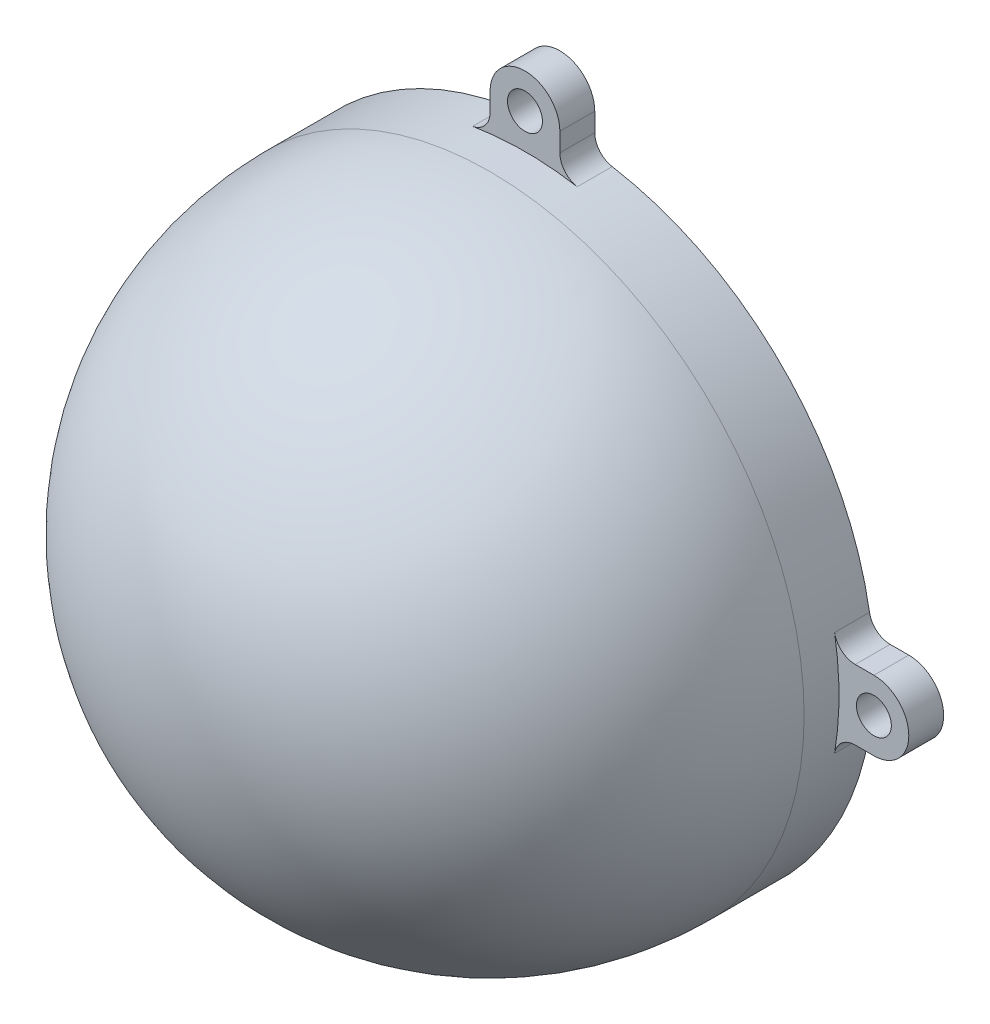
ISO-10303-21;
HEADER;
FILE_DESCRIPTION(('STEP AP214'),'2;1');
FILE_NAME('part.step','',(''),(''),'','','');
FILE_SCHEMA(('AUTOMOTIVE_DESIGN { 1 0 10303 214 1 1 1 1 }'));
ENDSEC;
DATA;
#1=APPLICATION_CONTEXT('core data for automotive mechanical design processes');
#2=APPLICATION_PROTOCOL_DEFINITION('international standard','automotive_design',2000,#1);
#3=PRODUCT_CONTEXT('',#1,'mechanical');
#4=PRODUCT('Part','Part','',(#3));
#5=PRODUCT_RELATED_PRODUCT_CATEGORY('part','',(#4));
#6=PRODUCT_DEFINITION_FORMATION('','',#4);
#7=PRODUCT_DEFINITION_CONTEXT('part definition',#1,'design');
#8=PRODUCT_DEFINITION('design','',#6,#7);
#9=PRODUCT_DEFINITION_SHAPE('','',#8);
#10=(LENGTH_UNIT() NAMED_UNIT(*) SI_UNIT(.MILLI.,.METRE.));
#11=(NAMED_UNIT(*) PLANE_ANGLE_UNIT() SI_UNIT($,.RADIAN.));
#12=(NAMED_UNIT(*) SI_UNIT($,.STERADIAN.) SOLID_ANGLE_UNIT());
#13=UNCERTAINTY_MEASURE_WITH_UNIT(LENGTH_MEASURE(1.E-05),#10,'distance_accuracy_value','');
#14=(GEOMETRIC_REPRESENTATION_CONTEXT(3) GLOBAL_UNCERTAINTY_ASSIGNED_CONTEXT((#13)) GLOBAL_UNIT_ASSIGNED_CONTEXT((#10,
#11,#12)) REPRESENTATION_CONTEXT('',''));
#15=CARTESIAN_POINT('',(0.,0.,0.));
#16=DIRECTION('',(0.,0.,1.));
#17=DIRECTION('',(1.,0.,0.));
#18=AXIS2_PLACEMENT_3D('',#15,#16,#17);
#19=CARTESIAN_POINT('',(0.,0.,10.));
#20=DIRECTION('',(0.,0.,-1.));
#21=DIRECTION('',(-1.,0.,0.));
#22=AXIS2_PLACEMENT_3D('',#19,#20,#21);
#23=CYLINDRICAL_SURFACE('',#22,45.);
#24=CARTESIAN_POINT('',(0.,0.,10.));
#25=DIRECTION('',(0.,0.,1.));
#26=DIRECTION('',(1.,0.,0.));
#27=AXIS2_PLACEMENT_3D('',#24,#25,#26);
#28=CIRCLE('',#27,45.);
#29=CARTESIAN_POINT('',(45.,0.,10.));
#30=VERTEX_POINT('',#29);
#31=EDGE_CURVE('E328',#30,#30,#28,.T.);
#32=ORIENTED_EDGE('',*,*,#31,.F.);
#33=EDGE_LOOP('',(#32));
#34=FACE_BOUND('',#33,.T.);
#35=CARTESIAN_POINT('',(0.,0.,0.));
#36=DIRECTION('',(0.,0.,1.));
#37=DIRECTION('',(1.,0.,0.));
#38=AXIS2_PLACEMENT_3D('',#35,#36,#37);
#39=CIRCLE('',#38,45.);
#40=CARTESIAN_POINT('',(7.5,-44.3705983732471,0.));
#41=VERTEX_POINT('',#40);
#42=CARTESIAN_POINT('',(44.3705983732472,-7.49999999999953,0.));
#43=VERTEX_POINT('',#42);
#44=EDGE_CURVE('E412',#41,#43,#39,.T.);
#45=ORIENTED_EDGE('',*,*,#44,.T.);
#46=DIRECTION('',(0.,0.,-1.));
#47=VECTOR('',#46,1.);
#48=CARTESIAN_POINT('',(44.3705983732472,-7.49999999999953,10.));
#49=LINE('',#48,#47);
#50=CARTESIAN_POINT('',(44.3705983732472,-7.49999999999953,5.));
#51=VERTEX_POINT('',#50);
#52=EDGE_CURVE('E401',#43,#51,#49,.F.);
#53=ORIENTED_EDGE('',*,*,#52,.T.);
#54=CARTESIAN_POINT('',(0.,0.,5.));
#55=DIRECTION('',(0.,0.,-1.));
#56=DIRECTION('',(0.,-1.,0.));
#57=AXIS2_PLACEMENT_3D('',#54,#55,#56);
#58=CIRCLE('',#57,45.);
#59=CARTESIAN_POINT('',(44.370598373247,7.50000000000046,5.));
#60=VERTEX_POINT('',#59);
#61=EDGE_CURVE('E212',#60,#51,#58,.T.);
#62=ORIENTED_EDGE('',*,*,#61,.F.);
#63=DIRECTION('',(0.,0.,-1.));
#64=VECTOR('',#63,1.);
#65=CARTESIAN_POINT('',(44.370598373247,7.50000000000046,10.));
#66=LINE('',#65,#64);
#67=CARTESIAN_POINT('',(44.370598373247,7.50000000000046,0.));
#68=VERTEX_POINT('',#67);
#69=EDGE_CURVE('E398',#60,#68,#66,.T.);
#70=ORIENTED_EDGE('',*,*,#69,.T.);
#71=CARTESIAN_POINT('',(7.5,44.3705983732471,0.));
#72=VERTEX_POINT('',#71);
#73=EDGE_CURVE('E327',#68,#72,#39,.T.);
#74=ORIENTED_EDGE('',*,*,#73,.T.);
#75=DIRECTION('',(0.,0.,-1.));
#76=VECTOR('',#75,1.);
#77=CARTESIAN_POINT('',(7.5,44.3705983732471,10.));
#78=LINE('',#77,#76);
#79=CARTESIAN_POINT('',(7.5,44.3705983732471,5.));
#80=VERTEX_POINT('',#79);
#81=EDGE_CURVE('E341',#72,#80,#78,.F.);
#82=ORIENTED_EDGE('',*,*,#81,.T.);
#83=CARTESIAN_POINT('',(0.,0.,5.));
#84=DIRECTION('',(0.,0.,-1.));
#85=DIRECTION('',(1.,0.,0.));
#86=AXIS2_PLACEMENT_3D('',#83,#84,#85);
#87=CIRCLE('',#86,45.);
#88=CARTESIAN_POINT('',(-7.5,44.3705983732471,5.));
#89=VERTEX_POINT('',#88);
#90=EDGE_CURVE('E300',#89,#80,#87,.T.);
#91=ORIENTED_EDGE('',*,*,#90,.F.);
#92=DIRECTION('',(0.,0.,-1.));
#93=VECTOR('',#92,1.);
#94=CARTESIAN_POINT('',(-7.5,44.3705983732471,10.));
#95=LINE('',#94,#93);
#96=CARTESIAN_POINT('',(-7.5,44.3705983732471,0.));
#97=VERTEX_POINT('',#96);
#98=EDGE_CURVE('E338',#89,#97,#95,.T.);
#99=ORIENTED_EDGE('',*,*,#98,.T.);
#100=CARTESIAN_POINT('',(-44.3705983732472,7.49999999999984,0.));
#101=VERTEX_POINT('',#100);
#102=EDGE_CURVE('E332',#97,#101,#39,.T.);
#103=ORIENTED_EDGE('',*,*,#102,.T.);
#104=DIRECTION('',(0.,0.,-1.));
#105=VECTOR('',#104,1.);
#106=CARTESIAN_POINT('',(-44.3705983732472,7.49999999999985,10.));
#107=LINE('',#106,#105);
#108=CARTESIAN_POINT('',(-44.3705983732472,7.49999999999984,5.));
#109=VERTEX_POINT('',#108);
#110=EDGE_CURVE('E362',#101,#109,#107,.F.);
#111=ORIENTED_EDGE('',*,*,#110,.T.);
#112=CARTESIAN_POINT('',(0.,0.,5.));
#113=DIRECTION('',(0.,0.,-1.));
#114=DIRECTION('',(0.,1.,0.));
#115=AXIS2_PLACEMENT_3D('',#112,#113,#114);
#116=CIRCLE('',#115,45.);
#117=CARTESIAN_POINT('',(-44.3705983732471,-7.50000000000015,5.));
#118=VERTEX_POINT('',#117);
#119=EDGE_CURVE('E272',#118,#109,#116,.T.);
#120=ORIENTED_EDGE('',*,*,#119,.F.);
#121=DIRECTION('',(0.,0.,-1.));
#122=VECTOR('',#121,1.);
#123=CARTESIAN_POINT('',(-44.3705983732471,-7.50000000000015,10.));
#124=LINE('',#123,#122);
#125=CARTESIAN_POINT('',(-44.3705983732471,-7.50000000000015,0.));
#126=VERTEX_POINT('',#125);
#127=EDGE_CURVE('E359',#118,#126,#124,.T.);
#128=ORIENTED_EDGE('',*,*,#127,.T.);
#129=CARTESIAN_POINT('',(-7.5,-44.3705983732471,0.));
#130=VERTEX_POINT('',#129);
#131=EDGE_CURVE('E335',#126,#130,#39,.T.);
#132=ORIENTED_EDGE('',*,*,#131,.T.);
#133=DIRECTION('',(0.,0.,-1.));
#134=VECTOR('',#133,1.);
#135=CARTESIAN_POINT('',(-7.5,-44.3705983732471,10.));
#136=LINE('',#135,#134);
#137=CARTESIAN_POINT('',(-7.5,-44.3705983732471,5.));
#138=VERTEX_POINT('',#137);
#139=EDGE_CURVE('E382',#130,#138,#136,.F.);
#140=ORIENTED_EDGE('',*,*,#139,.T.);
#141=CARTESIAN_POINT('',(0.,0.,5.));
#142=DIRECTION('',(0.,0.,-1.));
#143=DIRECTION('',(-1.,0.,0.));
#144=AXIS2_PLACEMENT_3D('',#141,#142,#143);
#145=CIRCLE('',#144,45.);
#146=CARTESIAN_POINT('',(7.5,-44.3705983732471,5.));
#147=VERTEX_POINT('',#146);
#148=EDGE_CURVE('E244',#147,#138,#145,.T.);
#149=ORIENTED_EDGE('',*,*,#148,.F.);
#150=DIRECTION('',(0.,0.,-1.));
#151=VECTOR('',#150,1.);
#152=CARTESIAN_POINT('',(7.5,-44.3705983732471,10.));
#153=LINE('',#152,#151);
#154=EDGE_CURVE('E379',#147,#41,#153,.T.);
#155=ORIENTED_EDGE('',*,*,#154,.T.);
#156=EDGE_LOOP('',(#45,#53,#62,#70,#74,#82,#91,#99,#103,#111,#120,#128,#132,#140,#149,#155));
#157=FACE_BOUND('',#156,.T.);
#158=ADVANCED_FACE('F39',(#34,#157),#23,.T.);
#159=CARTESIAN_POINT('',(0.,0.,0.));
#160=DIRECTION('',(0.,0.,1.));
#161=DIRECTION('',(1.,0.,0.));
#162=AXIS2_PLACEMENT_3D('',#159,#160,#161);
#163=PLANE('',#162);
#164=ORIENTED_EDGE('',*,*,#102,.F.);
#165=CARTESIAN_POINT('',(-8.,47.3286382647969,0.));
#166=DIRECTION('',(0.,0.,1.));
#167=DIRECTION('',(1.,0.,0.));
#168=AXIS2_PLACEMENT_3D('',#165,#166,#167);
#169=CIRCLE('',#168,3.);
#170=CARTESIAN_POINT('',(-5.,47.3286382647969,0.));
#171=VERTEX_POINT('',#170);
#172=EDGE_CURVE('E351',#97,#171,#169,.T.);
#173=ORIENTED_EDGE('',*,*,#172,.T.);
#174=DIRECTION('',(0.,-1.,0.));
#175=VECTOR('',#174,1.);
#176=CARTESIAN_POINT('',(-5.,50.,0.));
#177=LINE('',#176,#175);
#178=CARTESIAN_POINT('',(-5.,50.,0.));
#179=VERTEX_POINT('',#178);
#180=EDGE_CURVE('E303',#179,#171,#177,.T.);
#181=ORIENTED_EDGE('',*,*,#180,.F.);
#182=CARTESIAN_POINT('',(0.,50.,0.));
#183=DIRECTION('',(0.,0.,1.));
#184=DIRECTION('',(1.,0.,0.));
#185=AXIS2_PLACEMENT_3D('',#182,#183,#184);
#186=CIRCLE('',#185,5.);
#187=CARTESIAN_POINT('',(5.,50.,0.));
#188=VERTEX_POINT('',#187);
#189=EDGE_CURVE('E312',#188,#179,#186,.T.);
#190=ORIENTED_EDGE('',*,*,#189,.F.);
#191=DIRECTION('',(0.,1.,0.));
#192=VECTOR('',#191,1.);
#193=CARTESIAN_POINT('',(5.,44.7213595499958,0.));
#194=LINE('',#193,#192);
#195=CARTESIAN_POINT('',(5.,47.3286382647969,0.));
#196=VERTEX_POINT('',#195);
#197=EDGE_CURVE('E297',#196,#188,#194,.T.);
#198=ORIENTED_EDGE('',*,*,#197,.F.);
#199=CARTESIAN_POINT('',(8.,47.3286382647969,0.));
#200=DIRECTION('',(0.,0.,1.));
#201=DIRECTION('',(1.,0.,0.));
#202=AXIS2_PLACEMENT_3D('',#199,#200,#201);
#203=CIRCLE('',#202,3.);
#204=EDGE_CURVE('E346',#196,#72,#203,.T.);
#205=ORIENTED_EDGE('',*,*,#204,.T.);
#206=ORIENTED_EDGE('',*,*,#73,.F.);
#207=CARTESIAN_POINT('',(47.3286382647969,8.00000000000049,0.));
#208=DIRECTION('',(0.,0.,1.));
#209=DIRECTION('',(1.,0.,0.));
#210=AXIS2_PLACEMENT_3D('',#207,#208,#209);
#211=CIRCLE('',#210,3.);
#212=CARTESIAN_POINT('',(47.3286382647969,5.0000000000005,0.));
#213=VERTEX_POINT('',#212);
#214=EDGE_CURVE('E47',#68,#213,#211,.T.);
#215=ORIENTED_EDGE('',*,*,#214,.T.);
#216=DIRECTION('',(-1.,0.,0.));
#217=VECTOR('',#216,1.);
#218=CARTESIAN_POINT('',(50.,5.00000000000052,0.));
#219=LINE('',#218,#217);
#220=CARTESIAN_POINT('',(50.,5.00000000000052,0.));
#221=VERTEX_POINT('',#220);
#222=EDGE_CURVE('E235',#221,#213,#219,.T.);
#223=ORIENTED_EDGE('',*,*,#222,.F.);
#224=CARTESIAN_POINT('',(50.,5.2372220082647E-13,0.));
#225=DIRECTION('',(0.,0.,1.));
#226=DIRECTION('',(0.,-1.,0.));
#227=AXIS2_PLACEMENT_3D('',#224,#225,#226);
#228=CIRCLE('',#227,5.);
#229=CARTESIAN_POINT('',(50.0000000000001,-4.99999999999948,0.));
#230=VERTEX_POINT('',#229);
#231=EDGE_CURVE('E232',#230,#221,#228,.T.);
#232=ORIENTED_EDGE('',*,*,#231,.F.);
#233=DIRECTION('',(1.,0.,0.));
#234=VECTOR('',#233,1.);
#235=CARTESIAN_POINT('',(44.7213595499959,-4.99999999999953,0.));
#236=LINE('',#235,#234);
#237=CARTESIAN_POINT('',(47.328638264797,-4.9999999999995,0.));
#238=VERTEX_POINT('',#237);
#239=EDGE_CURVE('E218',#238,#230,#236,.T.);
#240=ORIENTED_EDGE('',*,*,#239,.F.);
#241=CARTESIAN_POINT('',(47.328638264797,-7.9999999999995,0.));
#242=DIRECTION('',(0.,0.,1.));
#243=DIRECTION('',(1.,0.,0.));
#244=AXIS2_PLACEMENT_3D('',#241,#242,#243);
#245=CIRCLE('',#244,3.);
#246=EDGE_CURVE('E405',#238,#43,#245,.T.);
#247=ORIENTED_EDGE('',*,*,#246,.T.);
#248=ORIENTED_EDGE('',*,*,#44,.F.);
#249=CARTESIAN_POINT('',(8.,-47.3286382647969,0.));
#250=DIRECTION('',(0.,0.,1.));
#251=DIRECTION('',(1.,0.,0.));
#252=AXIS2_PLACEMENT_3D('',#249,#250,#251);
#253=CIRCLE('',#252,3.);
#254=CARTESIAN_POINT('',(5.,-47.3286382647969,0.));
#255=VERTEX_POINT('',#254);
#256=EDGE_CURVE('E391',#41,#255,#253,.T.);
#257=ORIENTED_EDGE('',*,*,#256,.T.);
#258=DIRECTION('',(0.,1.,0.));
#259=VECTOR('',#258,1.);
#260=CARTESIAN_POINT('',(5.,-50.,0.));
#261=LINE('',#260,#259);
#262=CARTESIAN_POINT('',(5.,-50.,0.));
#263=VERTEX_POINT('',#262);
#264=EDGE_CURVE('E247',#263,#255,#261,.T.);
#265=ORIENTED_EDGE('',*,*,#264,.F.);
#266=CARTESIAN_POINT('',(0.,-50.,0.));
#267=DIRECTION('',(0.,0.,1.));
#268=DIRECTION('',(-1.,0.,0.));
#269=AXIS2_PLACEMENT_3D('',#266,#267,#268);
#270=CIRCLE('',#269,5.);
#271=CARTESIAN_POINT('',(-5.,-50.,0.));
#272=VERTEX_POINT('',#271);
#273=EDGE_CURVE('E256',#272,#263,#270,.T.);
#274=ORIENTED_EDGE('',*,*,#273,.F.);
#275=DIRECTION('',(0.,-1.,0.));
#276=VECTOR('',#275,1.);
#277=CARTESIAN_POINT('',(-5.,-44.7213595499958,0.));
#278=LINE('',#277,#276);
#279=CARTESIAN_POINT('',(-5.,-47.3286382647969,0.));
#280=VERTEX_POINT('',#279);
#281=EDGE_CURVE('E241',#280,#272,#278,.T.);
#282=ORIENTED_EDGE('',*,*,#281,.F.);
#283=CARTESIAN_POINT('',(-8.,-47.3286382647969,0.));
#284=DIRECTION('',(0.,0.,1.));
#285=DIRECTION('',(1.,0.,0.));
#286=AXIS2_PLACEMENT_3D('',#283,#284,#285);
#287=CIRCLE('',#286,3.);
#288=EDGE_CURVE('E387',#280,#130,#287,.T.);
#289=ORIENTED_EDGE('',*,*,#288,.T.);
#290=ORIENTED_EDGE('',*,*,#131,.F.);
#291=CARTESIAN_POINT('',(-47.3286382647969,-8.00000000000017,0.));
#292=DIRECTION('',(0.,0.,1.));
#293=DIRECTION('',(1.,0.,0.));
#294=AXIS2_PLACEMENT_3D('',#291,#292,#293);
#295=CIRCLE('',#294,3.);
#296=CARTESIAN_POINT('',(-47.3286382647969,-5.00000000000017,0.));
#297=VERTEX_POINT('',#296);
#298=EDGE_CURVE('E371',#126,#297,#295,.T.);
#299=ORIENTED_EDGE('',*,*,#298,.T.);
#300=DIRECTION('',(1.,0.,0.));
#301=VECTOR('',#300,1.);
#302=CARTESIAN_POINT('',(-50.,-5.00000000000017,0.));
#303=LINE('',#302,#301);
#304=CARTESIAN_POINT('',(-50.,-5.00000000000017,0.));
#305=VERTEX_POINT('',#304);
#306=EDGE_CURVE('E275',#305,#297,#303,.T.);
#307=ORIENTED_EDGE('',*,*,#306,.F.);
#308=CARTESIAN_POINT('',(-50.,-1.74574066942157E-13,0.));
#309=DIRECTION('',(0.,0.,1.));
#310=DIRECTION('',(0.,1.,0.));
#311=AXIS2_PLACEMENT_3D('',#308,#309,#310);
#312=CIRCLE('',#311,5.);
#313=CARTESIAN_POINT('',(-50.,4.99999999999983,0.));
#314=VERTEX_POINT('',#313);
#315=EDGE_CURVE('E284',#314,#305,#312,.T.);
#316=ORIENTED_EDGE('',*,*,#315,.F.);
#317=DIRECTION('',(-1.,0.,0.));
#318=VECTOR('',#317,1.);
#319=CARTESIAN_POINT('',(-44.7213595499958,4.99999999999984,0.));
#320=LINE('',#319,#318);
#321=CARTESIAN_POINT('',(-47.328638264797,4.99999999999984,0.));
#322=VERTEX_POINT('',#321);
#323=EDGE_CURVE('E269',#322,#314,#320,.T.);
#324=ORIENTED_EDGE('',*,*,#323,.F.);
#325=CARTESIAN_POINT('',(-47.328638264797,7.99999999999984,0.));
#326=DIRECTION('',(0.,0.,1.));
#327=DIRECTION('',(1.,0.,0.));
#328=AXIS2_PLACEMENT_3D('',#325,#326,#327);
#329=CIRCLE('',#328,3.);
#330=EDGE_CURVE('E367',#322,#101,#329,.T.);
#331=ORIENTED_EDGE('',*,*,#330,.T.);
#332=EDGE_LOOP('',(#164,#173,#181,#190,#198,#205,#206,#215,#223,#232,#240,#247,#248,#257,#265,
#274,#282,#289,#290,#299,#307,#316,#324,#331));
#333=FACE_BOUND('',#332,.T.);
#334=CARTESIAN_POINT('',(0.,0.,0.));
#335=DIRECTION('',(0.,0.,1.));
#336=DIRECTION('',(1.,0.,0.));
#337=AXIS2_PLACEMENT_3D('',#334,#335,#336);
#338=CIRCLE('',#337,42.5);
#339=CARTESIAN_POINT('',(42.5,0.,0.));
#340=VERTEX_POINT('',#339);
#341=EDGE_CURVE('E324',#340,#340,#338,.T.);
#342=ORIENTED_EDGE('',*,*,#341,.T.);
#343=EDGE_LOOP('',(#342));
#344=FACE_BOUND('',#343,.T.);
#345=CARTESIAN_POINT('',(0.,50.,0.));
#346=DIRECTION('',(0.,0.,1.));
#347=DIRECTION('',(1.,0.,0.));
#348=AXIS2_PLACEMENT_3D('',#345,#346,#347);
#349=CIRCLE('',#348,2.5);
#350=CARTESIAN_POINT('',(2.5,50.,0.));
#351=VERTEX_POINT('',#350);
#352=EDGE_CURVE('E293',#351,#351,#349,.T.);
#353=ORIENTED_EDGE('',*,*,#352,.T.);
#354=EDGE_LOOP('',(#353));
#355=FACE_BOUND('',#354,.T.);
#356=CARTESIAN_POINT('',(-50.,-1.74574066942157E-13,0.));
#357=DIRECTION('',(0.,0.,1.));
#358=DIRECTION('',(0.,1.,0.));
#359=AXIS2_PLACEMENT_3D('',#356,#357,#358);
#360=CIRCLE('',#359,2.5);
#361=CARTESIAN_POINT('',(-50.,2.49999999999983,0.));
#362=VERTEX_POINT('',#361);
#363=EDGE_CURVE('E265',#362,#362,#360,.T.);
#364=ORIENTED_EDGE('',*,*,#363,.T.);
#365=EDGE_LOOP('',(#364));
#366=FACE_BOUND('',#365,.T.);
#367=CARTESIAN_POINT('',(0.,-50.,0.));
#368=DIRECTION('',(0.,0.,1.));
#369=DIRECTION('',(-1.,0.,0.));
#370=AXIS2_PLACEMENT_3D('',#367,#368,#369);
#371=CIRCLE('',#370,2.5);
#372=CARTESIAN_POINT('',(-2.5,-50.,0.));
#373=VERTEX_POINT('',#372);
#374=EDGE_CURVE('E221',#373,#373,#371,.T.);
#375=ORIENTED_EDGE('',*,*,#374,.T.);
#376=EDGE_LOOP('',(#375));
#377=FACE_BOUND('',#376,.T.);
#378=CARTESIAN_POINT('',(50.,5.2372220082647E-13,0.));
#379=DIRECTION('',(0.,0.,1.));
#380=DIRECTION('',(0.,-1.,0.));
#381=AXIS2_PLACEMENT_3D('',#378,#379,#380);
#382=CIRCLE('',#381,2.5);
#383=CARTESIAN_POINT('',(50.,-2.49999999999948,0.));
#384=VERTEX_POINT('',#383);
#385=EDGE_CURVE('E559',#384,#384,#382,.T.);
#386=ORIENTED_EDGE('',*,*,#385,.T.);
#387=EDGE_LOOP('',(#386));
#388=FACE_BOUND('',#387,.T.);
#389=ADVANCED_FACE('F410',(#333,#344,#355,#366,#377,#388),#163,.F.);
#390=CARTESIAN_POINT('',(0.,0.,10.));
#391=DIRECTION('',(0.,0.,-1.));
#392=DIRECTION('',(-1.,0.,0.));
#393=AXIS2_PLACEMENT_3D('',#390,#391,#392);
#394=CYLINDRICAL_SURFACE('',#393,42.5);
#395=CARTESIAN_POINT('',(0.,0.,10.0000000000001));
#396=DIRECTION('',(0.,0.,1.));
#397=DIRECTION('',(0.,-1.,0.));
#398=AXIS2_PLACEMENT_3D('',#395,#396,#397);
#399=CIRCLE('',#398,42.5000000000001);
#400=CARTESIAN_POINT('',(0.,-42.5,10.));
#401=VERTEX_POINT('',#400);
#402=EDGE_CURVE('E321',#401,#401,#399,.T.);
#403=ORIENTED_EDGE('',*,*,#402,.T.);
#404=EDGE_LOOP('',(#403));
#405=FACE_BOUND('',#404,.T.);
#406=ORIENTED_EDGE('',*,*,#341,.F.);
#407=EDGE_LOOP('',(#406));
#408=FACE_BOUND('',#407,.T.);
#409=ADVANCED_FACE('F434',(#405,#408),#394,.F.);
#410=CARTESIAN_POINT('',(0.,0.,10.));
#411=DIRECTION('',(0.,0.,1.));
#412=DIRECTION('',(0.,-1.,0.));
#413=AXIS2_PLACEMENT_3D('',#410,#411,#412);
#414=SPHERICAL_SURFACE('',#413,42.5);
#415=ORIENTED_EDGE('',*,*,#402,.F.);
#416=EDGE_LOOP('',(#415));
#417=FACE_BOUND('',#416,.T.);
#418=ADVANCED_FACE('F537',(#417),#414,.F.);
#419=CARTESIAN_POINT('',(0.,0.,10.));
#420=DIRECTION('',(0.,0.,1.));
#421=DIRECTION('',(0.,1.,0.));
#422=AXIS2_PLACEMENT_3D('',#419,#420,#421);
#423=SPHERICAL_SURFACE('',#422,45.);
#424=ORIENTED_EDGE('',*,*,#31,.T.);
#425=EDGE_LOOP('',(#424));
#426=FACE_BOUND('',#425,.T.);
#427=ADVANCED_FACE('F525',(#426),#423,.T.);
#428=CARTESIAN_POINT('',(0.,0.,5.));
#429=DIRECTION('',(0.,0.,1.));
#430=DIRECTION('',(1.,0.,0.));
#431=AXIS2_PLACEMENT_3D('',#428,#429,#430);
#432=PLANE('',#431);
#433=ORIENTED_EDGE('',*,*,#90,.T.);
#434=CARTESIAN_POINT('',(8.,47.3286382647969,5.));
#435=DIRECTION('',(0.,0.,1.));
#436=DIRECTION('',(1.,0.,0.));
#437=AXIS2_PLACEMENT_3D('',#434,#435,#436);
#438=CIRCLE('',#437,3.);
#439=CARTESIAN_POINT('',(5.,47.3286382647969,5.));
#440=VERTEX_POINT('',#439);
#441=EDGE_CURVE('E349',#80,#440,#438,.F.);
#442=ORIENTED_EDGE('',*,*,#441,.T.);
#443=DIRECTION('',(0.,1.,0.));
#444=VECTOR('',#443,1.);
#445=CARTESIAN_POINT('',(5.,44.7213595499958,5.));
#446=LINE('',#445,#444);
#447=CARTESIAN_POINT('',(5.,50.,5.));
#448=VERTEX_POINT('',#447);
#449=EDGE_CURVE('E302',#440,#448,#446,.T.);
#450=ORIENTED_EDGE('',*,*,#449,.T.);
#451=CARTESIAN_POINT('',(0.,50.,5.));
#452=DIRECTION('',(0.,0.,1.));
#453=DIRECTION('',(1.,0.,0.));
#454=AXIS2_PLACEMENT_3D('',#451,#452,#453);
#455=CIRCLE('',#454,5.);
#456=CARTESIAN_POINT('',(-5.,50.,5.));
#457=VERTEX_POINT('',#456);
#458=EDGE_CURVE('E305',#448,#457,#455,.T.);
#459=ORIENTED_EDGE('',*,*,#458,.T.);
#460=DIRECTION('',(0.,-1.,0.));
#461=VECTOR('',#460,1.);
#462=CARTESIAN_POINT('',(-5.,50.,5.));
#463=LINE('',#462,#461);
#464=CARTESIAN_POINT('',(-5.,47.3286382647969,5.));
#465=VERTEX_POINT('',#464);
#466=EDGE_CURVE('E307',#457,#465,#463,.T.);
#467=ORIENTED_EDGE('',*,*,#466,.T.);
#468=CARTESIAN_POINT('',(-8.,47.3286382647969,5.));
#469=DIRECTION('',(0.,0.,1.));
#470=DIRECTION('',(1.,0.,0.));
#471=AXIS2_PLACEMENT_3D('',#468,#469,#470);
#472=CIRCLE('',#471,3.);
#473=EDGE_CURVE('E353',#465,#89,#472,.F.);
#474=ORIENTED_EDGE('',*,*,#473,.T.);
#475=EDGE_LOOP('',(#433,#442,#450,#459,#467,#474));
#476=FACE_BOUND('',#475,.T.);
#477=CARTESIAN_POINT('',(0.,50.,5.));
#478=DIRECTION('',(0.,0.,1.));
#479=DIRECTION('',(1.,0.,0.));
#480=AXIS2_PLACEMENT_3D('',#477,#478,#479);
#481=CIRCLE('',#480,2.5);
#482=CARTESIAN_POINT('',(2.5,50.,5.));
#483=VERTEX_POINT('',#482);
#484=EDGE_CURVE('E294',#483,#483,#481,.T.);
#485=ORIENTED_EDGE('',*,*,#484,.F.);
#486=EDGE_LOOP('',(#485));
#487=FACE_BOUND('',#486,.T.);
#488=ADVANCED_FACE('F521',(#476,#487),#432,.T.);
#489=CARTESIAN_POINT('',(5.,44.7213595499958,5.));
#490=DIRECTION('',(-1.,0.,0.));
#491=DIRECTION('',(0.,0.,1.));
#492=AXIS2_PLACEMENT_3D('',#489,#490,#491);
#493=PLANE('',#492);
#494=ORIENTED_EDGE('',*,*,#449,.F.);
#495=DIRECTION('',(0.,0.,1.));
#496=VECTOR('',#495,1.);
#497=CARTESIAN_POINT('',(5.,47.3286382647969,0.));
#498=LINE('',#497,#496);
#499=EDGE_CURVE('E331',#440,#196,#498,.F.);
#500=ORIENTED_EDGE('',*,*,#499,.T.);
#501=ORIENTED_EDGE('',*,*,#197,.T.);
#502=DIRECTION('',(0.,0.,-1.));
#503=VECTOR('',#502,1.);
#504=CARTESIAN_POINT('',(5.,50.,5.));
#505=LINE('',#504,#503);
#506=EDGE_CURVE('E318',#448,#188,#505,.T.);
#507=ORIENTED_EDGE('',*,*,#506,.F.);
#508=EDGE_LOOP('',(#494,#500,#501,#507));
#509=FACE_BOUND('',#508,.T.);
#510=ADVANCED_FACE('F524',(#509),#493,.F.);
#511=CARTESIAN_POINT('',(0.,50.,5.));
#512=DIRECTION('',(0.,0.,-1.));
#513=DIRECTION('',(-1.,0.,0.));
#514=AXIS2_PLACEMENT_3D('',#511,#512,#513);
#515=CYLINDRICAL_SURFACE('',#514,5.);
#516=ORIENTED_EDGE('',*,*,#189,.T.);
#517=DIRECTION('',(0.,0.,-1.));
#518=VECTOR('',#517,1.);
#519=CARTESIAN_POINT('',(-5.,50.,5.));
#520=LINE('',#519,#518);
#521=EDGE_CURVE('E310',#457,#179,#520,.T.);
#522=ORIENTED_EDGE('',*,*,#521,.F.);
#523=ORIENTED_EDGE('',*,*,#458,.F.);
#524=ORIENTED_EDGE('',*,*,#506,.T.);
#525=EDGE_LOOP('',(#516,#522,#523,#524));
#526=FACE_BOUND('',#525,.T.);
#527=ADVANCED_FACE('F529',(#526),#515,.T.);
#528=CARTESIAN_POINT('',(-5.,50.,5.));
#529=DIRECTION('',(1.,0.,0.));
#530=DIRECTION('',(0.,1.,0.));
#531=AXIS2_PLACEMENT_3D('',#528,#529,#530);
#532=PLANE('',#531);
#533=ORIENTED_EDGE('',*,*,#180,.T.);
#534=DIRECTION('',(0.,0.,1.));
#535=VECTOR('',#534,1.);
#536=CARTESIAN_POINT('',(-5.,47.3286382647969,5.));
#537=LINE('',#536,#535);
#538=EDGE_CURVE('E344',#171,#465,#537,.T.);
#539=ORIENTED_EDGE('',*,*,#538,.T.);
#540=ORIENTED_EDGE('',*,*,#466,.F.);
#541=ORIENTED_EDGE('',*,*,#521,.T.);
#542=EDGE_LOOP('',(#533,#539,#540,#541));
#543=FACE_BOUND('',#542,.T.);
#544=ADVANCED_FACE('F519',(#543),#532,.F.);
#545=CARTESIAN_POINT('',(0.,50.,5.));
#546=DIRECTION('',(0.,0.,-1.));
#547=DIRECTION('',(-1.,0.,0.));
#548=AXIS2_PLACEMENT_3D('',#545,#546,#547);
#549=CYLINDRICAL_SURFACE('',#548,2.5);
#550=ORIENTED_EDGE('',*,*,#484,.T.);
#551=EDGE_LOOP('',(#550));
#552=FACE_BOUND('',#551,.T.);
#553=ORIENTED_EDGE('',*,*,#352,.F.);
#554=EDGE_LOOP('',(#553));
#555=FACE_BOUND('',#554,.T.);
#556=ADVANCED_FACE('F443',(#552,#555),#549,.F.);
#557=CARTESIAN_POINT('',(8.,47.3286382647969,10.));
#558=DIRECTION('',(0.,0.,-1.));
#559=DIRECTION('',(-1.,0.,0.));
#560=AXIS2_PLACEMENT_3D('',#557,#558,#559);
#561=CYLINDRICAL_SURFACE('',#560,3.);
#562=ORIENTED_EDGE('',*,*,#441,.F.);
#563=ORIENTED_EDGE('',*,*,#81,.F.);
#564=ORIENTED_EDGE('',*,*,#204,.F.);
#565=ORIENTED_EDGE('',*,*,#499,.F.);
#566=EDGE_LOOP('',(#562,#563,#564,#565));
#567=FACE_BOUND('',#566,.T.);
#568=ADVANCED_FACE('F439',(#567),#561,.F.);
#569=CARTESIAN_POINT('',(-8.,47.3286382647969,10.));
#570=DIRECTION('',(0.,0.,-1.));
#571=DIRECTION('',(-1.,0.,0.));
#572=AXIS2_PLACEMENT_3D('',#569,#570,#571);
#573=CYLINDRICAL_SURFACE('',#572,3.);
#574=ORIENTED_EDGE('',*,*,#473,.F.);
#575=ORIENTED_EDGE('',*,*,#538,.F.);
#576=ORIENTED_EDGE('',*,*,#172,.F.);
#577=ORIENTED_EDGE('',*,*,#98,.F.);
#578=EDGE_LOOP('',(#574,#575,#576,#577));
#579=FACE_BOUND('',#578,.T.);
#580=ADVANCED_FACE('F442',(#579),#573,.F.);
#581=CARTESIAN_POINT('',(0.,0.,5.));
#582=DIRECTION('',(0.,0.,1.));
#583=DIRECTION('',(0.,1.,0.));
#584=AXIS2_PLACEMENT_3D('',#581,#582,#583);
#585=PLANE('',#584);
#586=ORIENTED_EDGE('',*,*,#119,.T.);
#587=CARTESIAN_POINT('',(-47.328638264797,7.99999999999984,5.));
#588=DIRECTION('',(0.,0.,1.));
#589=DIRECTION('',(1.,0.,0.));
#590=AXIS2_PLACEMENT_3D('',#587,#588,#589);
#591=CIRCLE('',#590,3.);
#592=CARTESIAN_POINT('',(-47.328638264797,4.99999999999984,5.));
#593=VERTEX_POINT('',#592);
#594=EDGE_CURVE('E369',#109,#593,#591,.F.);
#595=ORIENTED_EDGE('',*,*,#594,.T.);
#596=DIRECTION('',(-1.,0.,0.));
#597=VECTOR('',#596,1.);
#598=CARTESIAN_POINT('',(-44.7213595499958,4.99999999999984,5.));
#599=LINE('',#598,#597);
#600=CARTESIAN_POINT('',(-50.,4.99999999999983,5.));
#601=VERTEX_POINT('',#600);
#602=EDGE_CURVE('E274',#593,#601,#599,.T.);
#603=ORIENTED_EDGE('',*,*,#602,.T.);
#604=CARTESIAN_POINT('',(-50.,-1.74574066942157E-13,5.));
#605=DIRECTION('',(0.,0.,1.));
#606=DIRECTION('',(0.,1.,0.));
#607=AXIS2_PLACEMENT_3D('',#604,#605,#606);
#608=CIRCLE('',#607,5.);
#609=CARTESIAN_POINT('',(-50.,-5.00000000000017,5.));
#610=VERTEX_POINT('',#609);
#611=EDGE_CURVE('E277',#601,#610,#608,.T.);
#612=ORIENTED_EDGE('',*,*,#611,.T.);
#613=DIRECTION('',(1.,0.,0.));
#614=VECTOR('',#613,1.);
#615=CARTESIAN_POINT('',(-50.,-5.00000000000017,5.));
#616=LINE('',#615,#614);
#617=CARTESIAN_POINT('',(-47.3286382647969,-5.00000000000017,5.));
#618=VERTEX_POINT('',#617);
#619=EDGE_CURVE('E279',#610,#618,#616,.T.);
#620=ORIENTED_EDGE('',*,*,#619,.T.);
#621=CARTESIAN_POINT('',(-47.3286382647969,-8.00000000000017,5.));
#622=DIRECTION('',(0.,0.,1.));
#623=DIRECTION('',(1.,0.,0.));
#624=AXIS2_PLACEMENT_3D('',#621,#622,#623);
#625=CIRCLE('',#624,3.);
#626=EDGE_CURVE('E373',#618,#118,#625,.F.);
#627=ORIENTED_EDGE('',*,*,#626,.T.);
#628=EDGE_LOOP('',(#586,#595,#603,#612,#620,#627));
#629=FACE_BOUND('',#628,.T.);
#630=CARTESIAN_POINT('',(-50.,-1.74574066942157E-13,5.));
#631=DIRECTION('',(0.,0.,1.));
#632=DIRECTION('',(0.,1.,0.));
#633=AXIS2_PLACEMENT_3D('',#630,#631,#632);
#634=CIRCLE('',#633,2.5);
#635=CARTESIAN_POINT('',(-50.,2.49999999999983,5.));
#636=VERTEX_POINT('',#635);
#637=EDGE_CURVE('E266',#636,#636,#634,.T.);
#638=ORIENTED_EDGE('',*,*,#637,.F.);
#639=EDGE_LOOP('',(#638));
#640=FACE_BOUND('',#639,.T.);
#641=ADVANCED_FACE('F447',(#629,#640),#585,.T.);
#642=CARTESIAN_POINT('',(-44.7213595499958,4.99999999999984,5.));
#643=DIRECTION('',(0.,-1.,0.));
#644=DIRECTION('',(1.,0.,0.));
#645=AXIS2_PLACEMENT_3D('',#642,#643,#644);
#646=PLANE('',#645);
#647=ORIENTED_EDGE('',*,*,#602,.F.);
#648=DIRECTION('',(0.,0.,1.));
#649=VECTOR('',#648,1.);
#650=CARTESIAN_POINT('',(-47.328638264797,4.99999999999983,0.));
#651=LINE('',#650,#649);
#652=EDGE_CURVE('E356',#593,#322,#651,.F.);
#653=ORIENTED_EDGE('',*,*,#652,.T.);
#654=ORIENTED_EDGE('',*,*,#323,.T.);
#655=DIRECTION('',(0.,0.,-1.));
#656=VECTOR('',#655,1.);
#657=CARTESIAN_POINT('',(-50.,4.99999999999983,5.));
#658=LINE('',#657,#656);
#659=EDGE_CURVE('E290',#601,#314,#658,.T.);
#660=ORIENTED_EDGE('',*,*,#659,.F.);
#661=EDGE_LOOP('',(#647,#653,#654,#660));
#662=FACE_BOUND('',#661,.T.);
#663=ADVANCED_FACE('F505',(#662),#646,.F.);
#664=CARTESIAN_POINT('',(-50.,-1.74574066942157E-13,5.));
#665=DIRECTION('',(0.,0.,-1.));
#666=DIRECTION('',(-1.,0.,0.));
#667=AXIS2_PLACEMENT_3D('',#664,#665,#666);
#668=CYLINDRICAL_SURFACE('',#667,5.);
#669=ORIENTED_EDGE('',*,*,#315,.T.);
#670=DIRECTION('',(0.,0.,-1.));
#671=VECTOR('',#670,1.);
#672=CARTESIAN_POINT('',(-50.,-5.00000000000017,5.));
#673=LINE('',#672,#671);
#674=EDGE_CURVE('E282',#610,#305,#673,.T.);
#675=ORIENTED_EDGE('',*,*,#674,.F.);
#676=ORIENTED_EDGE('',*,*,#611,.F.);
#677=ORIENTED_EDGE('',*,*,#659,.T.);
#678=EDGE_LOOP('',(#669,#675,#676,#677));
#679=FACE_BOUND('',#678,.T.);
#680=ADVANCED_FACE('F509',(#679),#668,.T.);
#681=CARTESIAN_POINT('',(-50.,-5.00000000000017,5.));
#682=DIRECTION('',(0.,1.,0.));
#683=DIRECTION('',(-1.,0.,0.));
#684=AXIS2_PLACEMENT_3D('',#681,#682,#683);
#685=PLANE('',#684);
#686=ORIENTED_EDGE('',*,*,#306,.T.);
#687=DIRECTION('',(0.,0.,1.));
#688=VECTOR('',#687,1.);
#689=CARTESIAN_POINT('',(-47.3286382647969,-5.00000000000016,5.));
#690=LINE('',#689,#688);
#691=EDGE_CURVE('E365',#297,#618,#690,.T.);
#692=ORIENTED_EDGE('',*,*,#691,.T.);
#693=ORIENTED_EDGE('',*,*,#619,.F.);
#694=ORIENTED_EDGE('',*,*,#674,.T.);
#695=EDGE_LOOP('',(#686,#692,#693,#694));
#696=FACE_BOUND('',#695,.T.);
#697=ADVANCED_FACE('F501',(#696),#685,.F.);
#698=CARTESIAN_POINT('',(-50.,-1.74574066942157E-13,5.));
#699=DIRECTION('',(0.,0.,-1.));
#700=DIRECTION('',(-1.,0.,0.));
#701=AXIS2_PLACEMENT_3D('',#698,#699,#700);
#702=CYLINDRICAL_SURFACE('',#701,2.5);
#703=ORIENTED_EDGE('',*,*,#637,.T.);
#704=EDGE_LOOP('',(#703));
#705=FACE_BOUND('',#704,.T.);
#706=ORIENTED_EDGE('',*,*,#363,.F.);
#707=EDGE_LOOP('',(#706));
#708=FACE_BOUND('',#707,.T.);
#709=ADVANCED_FACE('F498',(#705,#708),#702,.F.);
#710=CARTESIAN_POINT('',(0.,0.,5.));
#711=DIRECTION('',(0.,0.,1.));
#712=DIRECTION('',(-1.,0.,0.));
#713=AXIS2_PLACEMENT_3D('',#710,#711,#712);
#714=PLANE('',#713);
#715=ORIENTED_EDGE('',*,*,#148,.T.);
#716=CARTESIAN_POINT('',(-8.,-47.3286382647969,5.));
#717=DIRECTION('',(0.,0.,1.));
#718=DIRECTION('',(1.,0.,0.));
#719=AXIS2_PLACEMENT_3D('',#716,#717,#718);
#720=CIRCLE('',#719,3.);
#721=CARTESIAN_POINT('',(-5.,-47.3286382647969,5.));
#722=VERTEX_POINT('',#721);
#723=EDGE_CURVE('E389',#138,#722,#720,.F.);
#724=ORIENTED_EDGE('',*,*,#723,.T.);
#725=DIRECTION('',(0.,-1.,0.));
#726=VECTOR('',#725,1.);
#727=CARTESIAN_POINT('',(-5.,-44.7213595499958,5.));
#728=LINE('',#727,#726);
#729=CARTESIAN_POINT('',(-5.,-50.,5.));
#730=VERTEX_POINT('',#729);
#731=EDGE_CURVE('E246',#722,#730,#728,.T.);
#732=ORIENTED_EDGE('',*,*,#731,.T.);
#733=CARTESIAN_POINT('',(0.,-50.,5.));
#734=DIRECTION('',(0.,0.,1.));
#735=DIRECTION('',(-1.,0.,0.));
#736=AXIS2_PLACEMENT_3D('',#733,#734,#735);
#737=CIRCLE('',#736,5.);
#738=CARTESIAN_POINT('',(5.,-50.,5.));
#739=VERTEX_POINT('',#738);
#740=EDGE_CURVE('E249',#730,#739,#737,.T.);
#741=ORIENTED_EDGE('',*,*,#740,.T.);
#742=DIRECTION('',(0.,1.,0.));
#743=VECTOR('',#742,1.);
#744=CARTESIAN_POINT('',(5.,-50.,5.));
#745=LINE('',#744,#743);
#746=CARTESIAN_POINT('',(5.,-47.3286382647969,5.));
#747=VERTEX_POINT('',#746);
#748=EDGE_CURVE('E251',#739,#747,#745,.T.);
#749=ORIENTED_EDGE('',*,*,#748,.T.);
#750=CARTESIAN_POINT('',(8.,-47.3286382647969,5.));
#751=DIRECTION('',(0.,0.,1.));
#752=DIRECTION('',(1.,0.,0.));
#753=AXIS2_PLACEMENT_3D('',#750,#751,#752);
#754=CIRCLE('',#753,3.);
#755=EDGE_CURVE('E393',#747,#147,#754,.F.);
#756=ORIENTED_EDGE('',*,*,#755,.T.);
#757=EDGE_LOOP('',(#715,#724,#732,#741,#749,#756));
#758=FACE_BOUND('',#757,.T.);
#759=CARTESIAN_POINT('',(0.,-50.,5.));
#760=DIRECTION('',(0.,0.,1.));
#761=DIRECTION('',(-1.,0.,0.));
#762=AXIS2_PLACEMENT_3D('',#759,#760,#761);
#763=CIRCLE('',#762,2.5);
#764=CARTESIAN_POINT('',(-2.5,-50.,5.));
#765=VERTEX_POINT('',#764);
#766=EDGE_CURVE('E238',#765,#765,#763,.T.);
#767=ORIENTED_EDGE('',*,*,#766,.F.);
#768=EDGE_LOOP('',(#767));
#769=FACE_BOUND('',#768,.T.);
#770=ADVANCED_FACE('F467',(#758,#769),#714,.T.);
#771=CARTESIAN_POINT('',(-5.,-44.7213595499958,5.));
#772=DIRECTION('',(1.,0.,0.));
#773=DIRECTION('',(0.,0.,-1.));
#774=AXIS2_PLACEMENT_3D('',#771,#772,#773);
#775=PLANE('',#774);
#776=ORIENTED_EDGE('',*,*,#731,.F.);
#777=DIRECTION('',(0.,0.,1.));
#778=VECTOR('',#777,1.);
#779=CARTESIAN_POINT('',(-5.,-47.3286382647969,0.));
#780=LINE('',#779,#778);
#781=EDGE_CURVE('E376',#722,#280,#780,.F.);
#782=ORIENTED_EDGE('',*,*,#781,.T.);
#783=ORIENTED_EDGE('',*,*,#281,.T.);
#784=DIRECTION('',(0.,0.,-1.));
#785=VECTOR('',#784,1.);
#786=CARTESIAN_POINT('',(-5.,-50.,5.));
#787=LINE('',#786,#785);
#788=EDGE_CURVE('E262',#730,#272,#787,.T.);
#789=ORIENTED_EDGE('',*,*,#788,.F.);
#790=EDGE_LOOP('',(#776,#782,#783,#789));
#791=FACE_BOUND('',#790,.T.);
#792=ADVANCED_FACE('F471',(#791),#775,.F.);
#793=CARTESIAN_POINT('',(0.,-50.,5.));
#794=DIRECTION('',(0.,0.,-1.));
#795=DIRECTION('',(-1.,0.,0.));
#796=AXIS2_PLACEMENT_3D('',#793,#794,#795);
#797=CYLINDRICAL_SURFACE('',#796,5.);
#798=ORIENTED_EDGE('',*,*,#273,.T.);
#799=DIRECTION('',(0.,0.,-1.));
#800=VECTOR('',#799,1.);
#801=CARTESIAN_POINT('',(5.,-50.,5.));
#802=LINE('',#801,#800);
#803=EDGE_CURVE('E254',#739,#263,#802,.T.);
#804=ORIENTED_EDGE('',*,*,#803,.F.);
#805=ORIENTED_EDGE('',*,*,#740,.F.);
#806=ORIENTED_EDGE('',*,*,#788,.T.);
#807=EDGE_LOOP('',(#798,#804,#805,#806));
#808=FACE_BOUND('',#807,.T.);
#809=ADVANCED_FACE('F477',(#808),#797,.T.);
#810=CARTESIAN_POINT('',(5.,-50.,5.));
#811=DIRECTION('',(-1.,0.,0.));
#812=DIRECTION('',(0.,-1.,0.));
#813=AXIS2_PLACEMENT_3D('',#810,#811,#812);
#814=PLANE('',#813);
#815=ORIENTED_EDGE('',*,*,#264,.T.);
#816=DIRECTION('',(0.,0.,1.));
#817=VECTOR('',#816,1.);
#818=CARTESIAN_POINT('',(5.,-47.3286382647969,5.));
#819=LINE('',#818,#817);
#820=EDGE_CURVE('E385',#255,#747,#819,.T.);
#821=ORIENTED_EDGE('',*,*,#820,.T.);
#822=ORIENTED_EDGE('',*,*,#748,.F.);
#823=ORIENTED_EDGE('',*,*,#803,.T.);
#824=EDGE_LOOP('',(#815,#821,#822,#823));
#825=FACE_BOUND('',#824,.T.);
#826=ADVANCED_FACE('F483',(#825),#814,.F.);
#827=CARTESIAN_POINT('',(0.,-50.,5.));
#828=DIRECTION('',(0.,0.,-1.));
#829=DIRECTION('',(-1.,0.,0.));
#830=AXIS2_PLACEMENT_3D('',#827,#828,#829);
#831=CYLINDRICAL_SURFACE('',#830,2.5);
#832=ORIENTED_EDGE('',*,*,#766,.T.);
#833=EDGE_LOOP('',(#832));
#834=FACE_BOUND('',#833,.T.);
#835=ORIENTED_EDGE('',*,*,#374,.F.);
#836=EDGE_LOOP('',(#835));
#837=FACE_BOUND('',#836,.T.);
#838=ADVANCED_FACE('F485',(#834,#837),#831,.F.);
#839=CARTESIAN_POINT('',(0.,0.,5.));
#840=DIRECTION('',(0.,0.,1.));
#841=DIRECTION('',(0.,-1.,0.));
#842=AXIS2_PLACEMENT_3D('',#839,#840,#841);
#843=PLANE('',#842);
#844=ORIENTED_EDGE('',*,*,#61,.T.);
#845=CARTESIAN_POINT('',(47.328638264797,-7.9999999999995,5.));
#846=DIRECTION('',(0.,0.,1.));
#847=DIRECTION('',(1.,0.,0.));
#848=AXIS2_PLACEMENT_3D('',#845,#846,#847);
#849=CIRCLE('',#848,3.);
#850=CARTESIAN_POINT('',(47.328638264797,-4.9999999999995,5.));
#851=VERTEX_POINT('',#850);
#852=EDGE_CURVE('E208',#51,#851,#849,.F.);
#853=ORIENTED_EDGE('',*,*,#852,.T.);
#854=DIRECTION('',(1.,0.,0.));
#855=VECTOR('',#854,1.);
#856=CARTESIAN_POINT('',(44.7213595499959,-4.99999999999953,5.));
#857=LINE('',#856,#855);
#858=CARTESIAN_POINT('',(50.0000000000001,-4.99999999999948,5.));
#859=VERTEX_POINT('',#858);
#860=EDGE_CURVE('E200',#851,#859,#857,.T.);
#861=ORIENTED_EDGE('',*,*,#860,.T.);
#862=CARTESIAN_POINT('',(50.,5.2372220082647E-13,5.));
#863=DIRECTION('',(0.,0.,1.));
#864=DIRECTION('',(0.,-1.,0.));
#865=AXIS2_PLACEMENT_3D('',#862,#863,#864);
#866=CIRCLE('',#865,5.);
#867=CARTESIAN_POINT('',(50.,5.00000000000052,5.));
#868=VERTEX_POINT('',#867);
#869=EDGE_CURVE('E205',#859,#868,#866,.T.);
#870=ORIENTED_EDGE('',*,*,#869,.T.);
#871=DIRECTION('',(-1.,0.,0.));
#872=VECTOR('',#871,1.);
#873=CARTESIAN_POINT('',(50.,5.00000000000052,5.));
#874=LINE('',#873,#872);
#875=CARTESIAN_POINT('',(47.3286382647969,5.0000000000005,5.));
#876=VERTEX_POINT('',#875);
#877=EDGE_CURVE('E226',#868,#876,#874,.T.);
#878=ORIENTED_EDGE('',*,*,#877,.T.);
#879=CARTESIAN_POINT('',(47.3286382647969,8.00000000000049,5.));
#880=DIRECTION('',(0.,0.,1.));
#881=DIRECTION('',(1.,0.,0.));
#882=AXIS2_PLACEMENT_3D('',#879,#880,#881);
#883=CIRCLE('',#882,3.);
#884=EDGE_CURVE('E11',#876,#60,#883,.F.);
#885=ORIENTED_EDGE('',*,*,#884,.T.);
#886=EDGE_LOOP('',(#844,#853,#861,#870,#878,#885));
#887=FACE_BOUND('',#886,.T.);
#888=CARTESIAN_POINT('',(50.,5.2372220082647E-13,5.));
#889=DIRECTION('',(0.,0.,1.));
#890=DIRECTION('',(0.,-1.,0.));
#891=AXIS2_PLACEMENT_3D('',#888,#889,#890);
#892=CIRCLE('',#891,2.5);
#893=CARTESIAN_POINT('',(50.,-2.49999999999948,5.));
#894=VERTEX_POINT('',#893);
#895=EDGE_CURVE('E233',#894,#894,#892,.T.);
#896=ORIENTED_EDGE('',*,*,#895,.F.);
#897=EDGE_LOOP('',(#896));
#898=FACE_BOUND('',#897,.T.);
#899=ADVANCED_FACE('F202',(#887,#898),#843,.T.);
#900=CARTESIAN_POINT('',(44.7213595499959,-4.99999999999953,5.));
#901=DIRECTION('',(0.,1.,0.));
#902=DIRECTION('',(-1.,0.,0.));
#903=AXIS2_PLACEMENT_3D('',#900,#901,#902);
#904=PLANE('',#903);
#905=ORIENTED_EDGE('',*,*,#860,.F.);
#906=DIRECTION('',(0.,0.,1.));
#907=VECTOR('',#906,1.);
#908=CARTESIAN_POINT('',(47.328638264797,-4.9999999999995,0.));
#909=LINE('',#908,#907);
#910=EDGE_CURVE('E396',#851,#238,#909,.F.);
#911=ORIENTED_EDGE('',*,*,#910,.T.);
#912=ORIENTED_EDGE('',*,*,#239,.T.);
#913=DIRECTION('',(0.,0.,-1.));
#914=VECTOR('',#913,1.);
#915=CARTESIAN_POINT('',(50.0000000000001,-4.99999999999948,5.));
#916=LINE('',#915,#914);
#917=EDGE_CURVE('E215',#859,#230,#916,.T.);
#918=ORIENTED_EDGE('',*,*,#917,.F.);
#919=EDGE_LOOP('',(#905,#911,#912,#918));
#920=FACE_BOUND('',#919,.T.);
#921=ADVANCED_FACE('F216',(#920),#904,.F.);
#922=CARTESIAN_POINT('',(50.,5.2372220082647E-13,5.));
#923=DIRECTION('',(0.,0.,-1.));
#924=DIRECTION('',(-1.,0.,0.));
#925=AXIS2_PLACEMENT_3D('',#922,#923,#924);
#926=CYLINDRICAL_SURFACE('',#925,5.);
#927=ORIENTED_EDGE('',*,*,#231,.T.);
#928=DIRECTION('',(0.,0.,-1.));
#929=VECTOR('',#928,1.);
#930=CARTESIAN_POINT('',(50.,5.00000000000052,5.));
#931=LINE('',#930,#929);
#932=EDGE_CURVE('E222',#868,#221,#931,.T.);
#933=ORIENTED_EDGE('',*,*,#932,.F.);
#934=ORIENTED_EDGE('',*,*,#869,.F.);
#935=ORIENTED_EDGE('',*,*,#917,.T.);
#936=EDGE_LOOP('',(#927,#933,#934,#935));
#937=FACE_BOUND('',#936,.T.);
#938=ADVANCED_FACE('F224',(#937),#926,.T.);
#939=CARTESIAN_POINT('',(50.,5.00000000000052,5.));
#940=DIRECTION('',(0.,-1.,0.));
#941=DIRECTION('',(1.,0.,0.));
#942=AXIS2_PLACEMENT_3D('',#939,#940,#941);
#943=PLANE('',#942);
#944=ORIENTED_EDGE('',*,*,#222,.T.);
#945=DIRECTION('',(0.,0.,1.));
#946=VECTOR('',#945,1.);
#947=CARTESIAN_POINT('',(47.3286382647969,5.0000000000005,5.));
#948=LINE('',#947,#946);
#949=EDGE_CURVE('E54',#213,#876,#948,.T.);
#950=ORIENTED_EDGE('',*,*,#949,.T.);
#951=ORIENTED_EDGE('',*,*,#877,.F.);
#952=ORIENTED_EDGE('',*,*,#932,.T.);
#953=EDGE_LOOP('',(#944,#950,#951,#952));
#954=FACE_BOUND('',#953,.T.);
#955=ADVANCED_FACE('F602',(#954),#943,.F.);
#956=CARTESIAN_POINT('',(50.,5.2372220082647E-13,5.));
#957=DIRECTION('',(0.,0.,-1.));
#958=DIRECTION('',(-1.,0.,0.));
#959=AXIS2_PLACEMENT_3D('',#956,#957,#958);
#960=CYLINDRICAL_SURFACE('',#959,2.5);
#961=ORIENTED_EDGE('',*,*,#895,.T.);
#962=EDGE_LOOP('',(#961));
#963=FACE_BOUND('',#962,.T.);
#964=ORIENTED_EDGE('',*,*,#385,.F.);
#965=EDGE_LOOP('',(#964));
#966=FACE_BOUND('',#965,.T.);
#967=ADVANCED_FACE('F453',(#963,#966),#960,.F.);
#968=CARTESIAN_POINT('',(-47.328638264797,7.99999999999984,10.));
#969=DIRECTION('',(0.,0.,-1.));
#970=DIRECTION('',(-1.,0.,0.));
#971=AXIS2_PLACEMENT_3D('',#968,#969,#970);
#972=CYLINDRICAL_SURFACE('',#971,3.);
#973=ORIENTED_EDGE('',*,*,#594,.F.);
#974=ORIENTED_EDGE('',*,*,#110,.F.);
#975=ORIENTED_EDGE('',*,*,#330,.F.);
#976=ORIENTED_EDGE('',*,*,#652,.F.);
#977=EDGE_LOOP('',(#973,#974,#975,#976));
#978=FACE_BOUND('',#977,.T.);
#979=ADVANCED_FACE('F449',(#978),#972,.F.);
#980=CARTESIAN_POINT('',(-47.3286382647969,-8.00000000000017,10.));
#981=DIRECTION('',(0.,0.,-1.));
#982=DIRECTION('',(-1.,0.,0.));
#983=AXIS2_PLACEMENT_3D('',#980,#981,#982);
#984=CYLINDRICAL_SURFACE('',#983,3.);
#985=ORIENTED_EDGE('',*,*,#626,.F.);
#986=ORIENTED_EDGE('',*,*,#691,.F.);
#987=ORIENTED_EDGE('',*,*,#298,.F.);
#988=ORIENTED_EDGE('',*,*,#127,.F.);
#989=EDGE_LOOP('',(#985,#986,#987,#988));
#990=FACE_BOUND('',#989,.T.);
#991=ADVANCED_FACE('F452',(#990),#984,.F.);
#992=CARTESIAN_POINT('',(-8.,-47.3286382647969,10.));
#993=DIRECTION('',(0.,0.,-1.));
#994=DIRECTION('',(-1.,0.,0.));
#995=AXIS2_PLACEMENT_3D('',#992,#993,#994);
#996=CYLINDRICAL_SURFACE('',#995,3.);
#997=ORIENTED_EDGE('',*,*,#723,.F.);
#998=ORIENTED_EDGE('',*,*,#139,.F.);
#999=ORIENTED_EDGE('',*,*,#288,.F.);
#1000=ORIENTED_EDGE('',*,*,#781,.F.);
#1001=EDGE_LOOP('',(#997,#998,#999,#1000));
#1002=FACE_BOUND('',#1001,.T.);
#1003=ADVANCED_FACE('F425',(#1002),#996,.F.);
#1004=CARTESIAN_POINT('',(8.,-47.3286382647969,10.));
#1005=DIRECTION('',(0.,0.,-1.));
#1006=DIRECTION('',(-1.,0.,0.));
#1007=AXIS2_PLACEMENT_3D('',#1004,#1005,#1006);
#1008=CYLINDRICAL_SURFACE('',#1007,3.);
#1009=ORIENTED_EDGE('',*,*,#755,.F.);
#1010=ORIENTED_EDGE('',*,*,#820,.F.);
#1011=ORIENTED_EDGE('',*,*,#256,.F.);
#1012=ORIENTED_EDGE('',*,*,#154,.F.);
#1013=EDGE_LOOP('',(#1009,#1010,#1011,#1012));
#1014=FACE_BOUND('',#1013,.T.);
#1015=ADVANCED_FACE('F419',(#1014),#1008,.F.);
#1016=CARTESIAN_POINT('',(47.328638264797,-7.9999999999995,10.));
#1017=DIRECTION('',(0.,0.,-1.));
#1018=DIRECTION('',(-1.,0.,0.));
#1019=AXIS2_PLACEMENT_3D('',#1016,#1017,#1018);
#1020=CYLINDRICAL_SURFACE('',#1019,3.);
#1021=ORIENTED_EDGE('',*,*,#852,.F.);
#1022=ORIENTED_EDGE('',*,*,#52,.F.);
#1023=ORIENTED_EDGE('',*,*,#246,.F.);
#1024=ORIENTED_EDGE('',*,*,#910,.F.);
#1025=EDGE_LOOP('',(#1021,#1022,#1023,#1024));
#1026=FACE_BOUND('',#1025,.T.);
#1027=ADVANCED_FACE('F417',(#1026),#1020,.F.);
#1028=CARTESIAN_POINT('',(47.3286382647969,8.00000000000049,10.));
#1029=DIRECTION('',(0.,0.,-1.));
#1030=DIRECTION('',(-1.,0.,0.));
#1031=AXIS2_PLACEMENT_3D('',#1028,#1029,#1030);
#1032=CYLINDRICAL_SURFACE('',#1031,3.);
#1033=ORIENTED_EDGE('',*,*,#884,.F.);
#1034=ORIENTED_EDGE('',*,*,#949,.F.);
#1035=ORIENTED_EDGE('',*,*,#214,.F.);
#1036=ORIENTED_EDGE('',*,*,#69,.F.);
#1037=EDGE_LOOP('',(#1033,#1034,#1035,#1036));
#1038=FACE_BOUND('',#1037,.T.);
#1039=ADVANCED_FACE('F41',(#1038),#1032,.F.);
#1040=CLOSED_SHELL('',(#158,#389,#409,#418,#427,#488,#510,#527,#544,#556,#568,#580,#641,#663,
#680,#697,#709,#770,#792,#809,#826,#838,#899,#921,#938,#955,#967,#979,#991,#1003,#1015,#1027,#1039));
#1041=MANIFOLD_SOLID_BREP('B2',#1040);
#1042=ADVANCED_BREP_SHAPE_REPRESENTATION('',(#18,#1041),#14);
#1043=SHAPE_DEFINITION_REPRESENTATION(#9,#1042);
ENDSEC;
END-ISO-10303-21;
